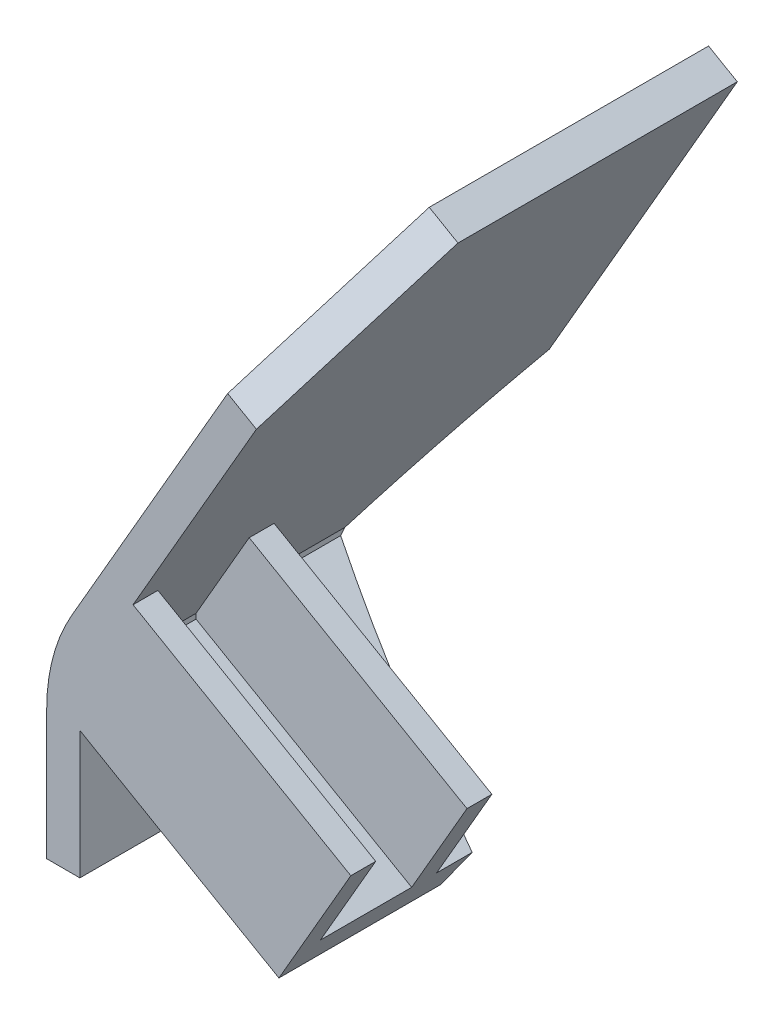
ISO-10303-21;
HEADER;
FILE_DESCRIPTION(('STEP AP214'),'2;1');
FILE_NAME('part.step','',(''),(''),'','','');
FILE_SCHEMA(('AUTOMOTIVE_DESIGN { 1 0 10303 214 1 1 1 1 }'));
ENDSEC;
DATA;
#1=APPLICATION_CONTEXT('core data for automotive mechanical design processes');
#2=APPLICATION_PROTOCOL_DEFINITION('international standard','automotive_design',2000,#1);
#3=PRODUCT_CONTEXT('',#1,'mechanical');
#4=PRODUCT('Part','Part','',(#3));
#5=PRODUCT_RELATED_PRODUCT_CATEGORY('part','',(#4));
#6=PRODUCT_DEFINITION_FORMATION('','',#4);
#7=PRODUCT_DEFINITION_CONTEXT('part definition',#1,'design');
#8=PRODUCT_DEFINITION('design','',#6,#7);
#9=PRODUCT_DEFINITION_SHAPE('','',#8);
#10=(LENGTH_UNIT() NAMED_UNIT(*) SI_UNIT(.MILLI.,.METRE.));
#11=(NAMED_UNIT(*) PLANE_ANGLE_UNIT() SI_UNIT($,.RADIAN.));
#12=(NAMED_UNIT(*) SI_UNIT($,.STERADIAN.) SOLID_ANGLE_UNIT());
#13=UNCERTAINTY_MEASURE_WITH_UNIT(LENGTH_MEASURE(1.E-05),#10,'distance_accuracy_value','');
#14=(GEOMETRIC_REPRESENTATION_CONTEXT(3) GLOBAL_UNCERTAINTY_ASSIGNED_CONTEXT((#13)) GLOBAL_UNIT_ASSIGNED_CONTEXT((#10,
#11,#12)) REPRESENTATION_CONTEXT('',''));
#15=CARTESIAN_POINT('',(0.,0.,0.));
#16=DIRECTION('',(0.,0.,1.));
#17=DIRECTION('',(1.,0.,0.));
#18=AXIS2_PLACEMENT_3D('',#15,#16,#17);
#19=CARTESIAN_POINT('',(-23.0092104418444,-16.2678308865809,18.));
#20=DIRECTION('',(1.,0.,0.));
#21=DIRECTION('',(0.,0.,-1.));
#22=AXIS2_PLACEMENT_3D('',#19,#20,#21);
#23=PLANE('',#22);
#24=CARTESIAN_POINT('',(-23.0092104418444,-44.4746281955842,-57.4228165048761));
#25=DIRECTION('',(-1.,0.,0.));
#26=DIRECTION('',(0.,0.,1.));
#27=AXIS2_PLACEMENT_3D('',#24,#25,#26);
#28=CIRCLE('',#27,67.4999999999585);
#29=CARTESIAN_POINT('',(-23.0092104418444,-16.2678308865809,3.90113139122078));
#30=VERTEX_POINT('',#29);
#31=CARTESIAN_POINT('',(-23.0092104418444,-4.55513627132909,-2.99227209731268));
#32=VERTEX_POINT('',#31);
#33=EDGE_CURVE('E183',#30,#32,#28,.T.);
#34=ORIENTED_EDGE('',*,*,#33,.F.);
#35=DIRECTION('',(0.,0.,-1.));
#36=VECTOR('',#35,1.);
#37=CARTESIAN_POINT('',(-23.0092104418444,-16.2678308865809,18.));
#38=LINE('',#37,#36);
#39=CARTESIAN_POINT('',(-23.0092104418444,-16.2678308865809,18.));
#40=VERTEX_POINT('',#39);
#41=EDGE_CURVE('E199',#40,#30,#38,.T.);
#42=ORIENTED_EDGE('',*,*,#41,.F.);
#43=DIRECTION('',(0.,-1.,0.));
#44=VECTOR('',#43,1.);
#45=CARTESIAN_POINT('',(-23.0092104418444,-16.2678308865809,18.));
#46=LINE('',#45,#44);
#47=CARTESIAN_POINT('',(-23.0092104418444,-4.55513627132909,18.));
#48=VERTEX_POINT('',#47);
#49=EDGE_CURVE('E307',#48,#40,#46,.T.);
#50=ORIENTED_EDGE('',*,*,#49,.F.);
#51=DIRECTION('',(0.,0.,-1.));
#52=VECTOR('',#51,1.);
#53=CARTESIAN_POINT('',(-23.0092104418444,-4.55513627132909,18.));
#54=LINE('',#53,#52);
#55=EDGE_CURVE('E201',#48,#32,#54,.T.);
#56=ORIENTED_EDGE('',*,*,#55,.T.);
#57=EDGE_LOOP('',(#34,#42,#50,#56));
#58=FACE_BOUND('',#57,.T.);
#59=ADVANCED_FACE('F46',(#58),#23,.F.);
#60=CARTESIAN_POINT('',(-20.0092104418444,-0.803847577293367,18.));
#61=DIRECTION('',(-0.866025403784439,0.5,0.));
#62=DIRECTION('',(-0.5,-0.866025403784439,0.));
#63=AXIS2_PLACEMENT_3D('',#60,#61,#62);
#64=PLANE('',#63);
#65=DIRECTION('',(0.,0.,-1.));
#66=VECTOR('',#65,1.);
#67=CARTESIAN_POINT('',(-20.0092104418444,-0.803847577293367,18.));
#68=LINE('',#67,#66);
#69=CARTESIAN_POINT('',(-20.0092104418444,-0.803847577293367,5.25));
#70=VERTEX_POINT('',#69);
#71=CARTESIAN_POINT('',(-20.0092104418444,-0.803847577293369,-5.95328260195916));
#72=VERTEX_POINT('',#71);
#73=EDGE_CURVE('E320',#70,#72,#68,.T.);
#74=ORIENTED_EDGE('',*,*,#73,.T.);
#75=CARTESIAN_POINT('',(-45.2225473875357,-44.4746281955842,-57.4228165048761));
#76=DIRECTION('',(-0.866025403784439,0.5,0.));
#77=DIRECTION('',(-0.5,-0.866025403784439,0.));
#78=AXIS2_PLACEMENT_3D('',#75,#76,#77);
#79=ELLIPSE('',#78,77.9422863405516,67.4999999999585);
#80=CARTESIAN_POINT('',(-13.5887493290389,10.316717278106,-18.));
#81=VERTEX_POINT('',#80);
#82=EDGE_CURVE('E194',#72,#81,#79,.T.);
#83=ORIENTED_EDGE('',*,*,#82,.T.);
#84=DIRECTION('',(0.5,0.866025403784439,0.));
#85=VECTOR('',#84,1.);
#86=CARTESIAN_POINT('',(-20.0092104418444,-0.803847577293367,-18.));
#87=LINE('',#86,#85);
#88=CARTESIAN_POINT('',(3.4161113789648,39.77,-18.));
#89=VERTEX_POINT('',#88);
#90=EDGE_CURVE('E231',#81,#89,#87,.T.);
#91=ORIENTED_EDGE('',*,*,#90,.T.);
#92=DIRECTION('',(0.,0.,-1.));
#93=VECTOR('',#92,1.);
#94=CARTESIAN_POINT('',(3.4161113789648,39.77,18.));
#95=LINE('',#94,#93);
#96=CARTESIAN_POINT('',(3.4161113789648,39.77,7.2485351115768));
#97=VERTEX_POINT('',#96);
#98=EDGE_CURVE('E221',#97,#89,#95,.T.);
#99=ORIENTED_EDGE('',*,*,#98,.F.);
#100=DIRECTION('',(0.405819313764916,0.70289967013357,-0.58415985680419));
#101=VECTOR('',#100,1.);
#102=CARTESIAN_POINT('',(-14.5642677858138,8.62706974725056,33.1305357012939));
#103=LINE('',#102,#101);
#104=CARTESIAN_POINT('',(-4.05299498321717,26.8331282935649,18.));
#105=VERTEX_POINT('',#104);
#106=EDGE_CURVE('E69',#105,#97,#103,.T.);
#107=ORIENTED_EDGE('',*,*,#106,.F.);
#108=DIRECTION('',(0.5,0.866025403784439,0.));
#109=VECTOR('',#108,1.);
#110=CARTESIAN_POINT('',(-20.0092104418444,-0.803847577293367,18.));
#111=LINE('',#110,#109);
#112=CARTESIAN_POINT('',(-15.2053116366151,7.51674922778309,18.));
#113=VERTEX_POINT('',#112);
#114=EDGE_CURVE('E314',#113,#105,#111,.T.);
#115=ORIENTED_EDGE('',*,*,#114,.F.);
#116=DIRECTION('',(0.,0.,-1.));
#117=VECTOR('',#116,1.);
#118=CARTESIAN_POINT('',(-15.2053116366151,7.51674922778309,18.));
#119=LINE('',#118,#117);
#120=CARTESIAN_POINT('',(-15.2053116366151,7.51674922778309,15.75));
#121=VERTEX_POINT('',#120);
#122=EDGE_CURVE('E289',#113,#121,#119,.T.);
#123=ORIENTED_EDGE('',*,*,#122,.T.);
#124=DIRECTION('',(-0.5,-0.866025403784439,0.));
#125=VECTOR('',#124,1.);
#126=CARTESIAN_POINT('',(-15.2053116366151,7.51674922778308,15.75));
#127=LINE('',#126,#125);
#128=CARTESIAN_POINT('',(-20.0092104418444,-0.803847577293367,15.75));
#129=VERTEX_POINT('',#128);
#130=EDGE_CURVE('E287',#121,#129,#127,.T.);
#131=ORIENTED_EDGE('',*,*,#130,.T.);
#132=CARTESIAN_POINT('',(-20.0092104418444,-0.803847577293367,7.5));
#133=VERTEX_POINT('',#132);
#134=EDGE_CURVE('E212',#129,#133,#68,.T.);
#135=ORIENTED_EDGE('',*,*,#134,.T.);
#136=DIRECTION('',(0.5,0.866025403784439,0.));
#137=VECTOR('',#136,1.);
#138=CARTESIAN_POINT('',(-20.2053116366151,-1.1435048100613,7.5));
#139=LINE('',#138,#137);
#140=CARTESIAN_POINT('',(-15.2053116366151,7.51674922778309,7.5));
#141=VERTEX_POINT('',#140);
#142=EDGE_CURVE('E298',#133,#141,#139,.T.);
#143=ORIENTED_EDGE('',*,*,#142,.T.);
#144=DIRECTION('',(0.,0.,-1.));
#145=VECTOR('',#144,1.);
#146=CARTESIAN_POINT('',(-15.2053116366151,7.51674922778309,7.5));
#147=LINE('',#146,#145);
#148=CARTESIAN_POINT('',(-15.2053116366151,7.51674922778309,5.25));
#149=VERTEX_POINT('',#148);
#150=EDGE_CURVE('E296',#141,#149,#147,.T.);
#151=ORIENTED_EDGE('',*,*,#150,.T.);
#152=DIRECTION('',(-0.5,-0.866025403784439,0.));
#153=VECTOR('',#152,1.);
#154=CARTESIAN_POINT('',(-15.2053116366151,7.51674922778308,5.25));
#155=LINE('',#154,#153);
#156=EDGE_CURVE('E305',#149,#70,#155,.T.);
#157=ORIENTED_EDGE('',*,*,#156,.T.);
#158=EDGE_LOOP('',(#74,#83,#91,#99,#107,#115,#123,#131,#135,#143,#151,#157));
#159=FACE_BOUND('',#158,.T.);
#160=ADVANCED_FACE('F230',(#159),#64,.F.);
#161=CARTESIAN_POINT('',(-23.0092104418444,0.,18.));
#162=DIRECTION('',(0.866025403784439,-0.5,0.));
#163=DIRECTION('',(0.5,0.866025403784439,0.));
#164=AXIS2_PLACEMENT_3D('',#161,#162,#163);
#165=PLANE('',#164);
#166=DIRECTION('',(-0.5,-0.866025403784439,0.));
#167=VECTOR('',#166,1.);
#168=CARTESIAN_POINT('',(-23.0092104418444,0.,-18.));
#169=LINE('',#168,#167);
#170=CARTESIAN_POINT('',(0.81803516761145,41.27,-18.));
#171=VERTEX_POINT('',#170);
#172=CARTESIAN_POINT('',(-17.0528509441766,10.316717278106,-18.));
#173=VERTEX_POINT('',#172);
#174=EDGE_CURVE('E284',#171,#173,#169,.T.);
#175=ORIENTED_EDGE('',*,*,#174,.T.);
#176=CARTESIAN_POINT('',(-48.6866490026734,-44.4746281955842,-57.4228165048761));
#177=DIRECTION('',(0.866025403784439,-0.5,0.));
#178=DIRECTION('',(-0.5,-0.866025403784439,0.));
#179=AXIS2_PLACEMENT_3D('',#176,#177,#178);
#180=ELLIPSE('',#179,77.9422863405516,67.4999999999585);
#181=CARTESIAN_POINT('',(-20.7316423061798,3.94486372867091,-10.3930089165881));
#182=VERTEX_POINT('',#181);
#183=EDGE_CURVE('E363',#173,#182,#180,.T.);
#184=ORIENTED_EDGE('',*,*,#183,.T.);
#185=DIRECTION('',(0.,0.,-1.));
#186=VECTOR('',#185,1.);
#187=CARTESIAN_POINT('',(-20.7316423061798,3.94486372867091,18.));
#188=LINE('',#187,#186);
#189=CARTESIAN_POINT('',(-20.7316423061798,3.94486372867091,18.));
#190=VERTEX_POINT('',#189);
#191=EDGE_CURVE('E209',#182,#190,#188,.F.);
#192=ORIENTED_EDGE('',*,*,#191,.T.);
#193=DIRECTION('',(-0.5,-0.866025403784439,0.));
#194=VECTOR('',#193,1.);
#195=CARTESIAN_POINT('',(-23.0092104418444,0.,18.));
#196=LINE('',#195,#194);
#197=CARTESIAN_POINT('',(-6.65107119457049,28.3331282935649,18.));
#198=VERTEX_POINT('',#197);
#199=EDGE_CURVE('E306',#198,#190,#196,.T.);
#200=ORIENTED_EDGE('',*,*,#199,.F.);
#201=DIRECTION('',(-0.405819313764916,-0.70289967013357,0.58415985680419));
#202=VECTOR('',#201,1.);
#203=CARTESIAN_POINT('',(-17.4271142115875,9.66847428354355,33.5116613039837));
#204=LINE('',#203,#202);
#205=CARTESIAN_POINT('',(0.818035167611447,41.27,7.2485351115768));
#206=VERTEX_POINT('',#205);
#207=EDGE_CURVE('E371',#206,#198,#204,.T.);
#208=ORIENTED_EDGE('',*,*,#207,.F.);
#209=DIRECTION('',(0.,0.,1.));
#210=VECTOR('',#209,1.);
#211=CARTESIAN_POINT('',(0.818035167611496,41.27,18.));
#212=LINE('',#211,#210);
#213=EDGE_CURVE('E222',#171,#206,#212,.T.);
#214=ORIENTED_EDGE('',*,*,#213,.F.);
#215=EDGE_LOOP('',(#175,#184,#192,#200,#208,#214));
#216=FACE_BOUND('',#215,.T.);
#217=ADVANCED_FACE('F413',(#216),#165,.F.);
#218=CARTESIAN_POINT('',(0.,0.,18.));
#219=DIRECTION('',(0.,0.,1.));
#220=DIRECTION('',(1.,0.,0.));
#221=AXIS2_PLACEMENT_3D('',#218,#219,#220);
#222=PLANE('',#221);
#223=ORIENTED_EDGE('',*,*,#114,.T.);
#224=DIRECTION('',(-0.866025403784438,0.500000000000001,0.));
#225=VECTOR('',#224,1.);
#226=CARTESIAN_POINT('',(10.6058366368128,18.3698479117351,18.));
#227=LINE('',#226,#225);
#228=EDGE_CURVE('E238',#105,#198,#227,.T.);
#229=ORIENTED_EDGE('',*,*,#228,.T.);
#230=ORIENTED_EDGE('',*,*,#199,.T.);
#231=CARTESIAN_POINT('',(-6.00921044184436,-4.55513627132909,18.));
#232=DIRECTION('',(0.,0.,1.));
#233=DIRECTION('',(1.,0.,0.));
#234=AXIS2_PLACEMENT_3D('',#231,#232,#233);
#235=CIRCLE('',#234,17.);
#236=EDGE_CURVE('E217',#190,#48,#235,.T.);
#237=ORIENTED_EDGE('',*,*,#236,.T.);
#238=ORIENTED_EDGE('',*,*,#49,.T.);
#239=DIRECTION('',(1.,0.,0.));
#240=VECTOR('',#239,1.);
#241=CARTESIAN_POINT('',(-20.0092104418444,-16.2678308865809,18.));
#242=LINE('',#241,#240);
#243=CARTESIAN_POINT('',(-20.0092104418444,-16.2678308865809,18.));
#244=VERTEX_POINT('',#243);
#245=EDGE_CURVE('E207',#40,#244,#242,.T.);
#246=ORIENTED_EDGE('',*,*,#245,.T.);
#247=DIRECTION('',(0.,1.,0.));
#248=VECTOR('',#247,1.);
#249=CARTESIAN_POINT('',(-20.0092104418444,-16.2678308865809,18.));
#250=LINE('',#249,#248);
#251=CARTESIAN_POINT('',(-20.0092104418444,-4.72082550278836,18.));
#252=VERTEX_POINT('',#251);
#253=EDGE_CURVE('E315',#244,#252,#250,.T.);
#254=ORIENTED_EDGE('',*,*,#253,.T.);
#255=DIRECTION('',(0.86602540378444,-0.499999999999998,0.));
#256=VECTOR('',#255,1.);
#257=CARTESIAN_POINT('',(-24.305119898776,-2.24058102141463,18.));
#258=LINE('',#257,#256);
#259=CARTESIAN_POINT('',(-2.01882938507779,-15.1075768487364,18.));
#260=VERTEX_POINT('',#259);
#261=EDGE_CURVE('E269',#252,#260,#258,.T.);
#262=ORIENTED_EDGE('',*,*,#261,.T.);
#263=DIRECTION('',(-0.499999999999998,-0.86602540378444,0.));
#264=VECTOR('',#263,1.);
#265=CARTESIAN_POINT('',(-2.01882938507779,-15.1075768487364,18.));
#266=LINE('',#265,#264);
#267=CARTESIAN_POINT('',(4.48117061492218,-3.84924659953871,18.));
#268=VERTEX_POINT('',#267);
#269=EDGE_CURVE('E257',#268,#260,#266,.T.);
#270=ORIENTED_EDGE('',*,*,#269,.F.);
#271=DIRECTION('',(0.86602540378444,-0.499999999999998,0.));
#272=VECTOR('',#271,1.);
#273=CARTESIAN_POINT('',(-17.805119898776,9.01774922778309,18.));
#274=LINE('',#273,#272);
#275=EDGE_CURVE('E270',#113,#268,#274,.T.);
#276=ORIENTED_EDGE('',*,*,#275,.F.);
#277=EDGE_LOOP('',(#223,#229,#230,#237,#238,#246,#254,#262,#270,#276));
#278=FACE_BOUND('',#277,.T.);
#279=ADVANCED_FACE('F384',(#278),#222,.T.);
#280=CARTESIAN_POINT('',(18.0749429989948,31.3067196181703,0.));
#281=DIRECTION('',(0.5,0.866025403784439,0.));
#282=DIRECTION('',(-0.866025403784439,0.5,0.));
#283=AXIS2_PLACEMENT_3D('',#280,#281,#282);
#284=PLANE('',#283);
#285=ORIENTED_EDGE('',*,*,#213,.T.);
#286=DIRECTION('',(0.866025403784439,-0.5,0.));
#287=VECTOR('',#286,1.);
#288=CARTESIAN_POINT('',(18.0749429989948,31.3067196181703,7.24853511157679));
#289=LINE('',#288,#287);
#290=EDGE_CURVE('E54',#206,#97,#289,.T.);
#291=ORIENTED_EDGE('',*,*,#290,.T.);
#292=ORIENTED_EDGE('',*,*,#98,.T.);
#293=DIRECTION('',(-0.866025403784439,0.5,0.));
#294=VECTOR('',#293,1.);
#295=CARTESIAN_POINT('',(18.0749429989948,31.3067196181703,-18.));
#296=LINE('',#295,#294);
#297=EDGE_CURVE('E234',#89,#171,#296,.T.);
#298=ORIENTED_EDGE('',*,*,#297,.T.);
#299=EDGE_LOOP('',(#285,#291,#292,#298));
#300=FACE_BOUND('',#299,.T.);
#301=ADVANCED_FACE('F224',(#300),#284,.T.);
#302=CARTESIAN_POINT('',(0.,0.,-18.));
#303=DIRECTION('',(0.,0.,1.));
#304=DIRECTION('',(1.,0.,0.));
#305=AXIS2_PLACEMENT_3D('',#302,#303,#304);
#306=PLANE('',#305);
#307=ORIENTED_EDGE('',*,*,#90,.F.);
#308=DIRECTION('',(-1.,0.,0.));
#309=VECTOR('',#308,1.);
#310=CARTESIAN_POINT('',(4.48117061492218,10.316717278106,-18.));
#311=LINE('',#310,#309);
#312=EDGE_CURVE('E195',#81,#173,#311,.T.);
#313=ORIENTED_EDGE('',*,*,#312,.T.);
#314=ORIENTED_EDGE('',*,*,#174,.F.);
#315=ORIENTED_EDGE('',*,*,#297,.F.);
#316=EDGE_LOOP('',(#307,#313,#314,#315));
#317=FACE_BOUND('',#316,.T.);
#318=ADVANCED_FACE('F385',(#317),#306,.F.);
#319=CARTESIAN_POINT('',(-20.0092104418444,-16.2678308865809,18.));
#320=DIRECTION('',(-1.,0.,0.));
#321=DIRECTION('',(0.,0.,1.));
#322=AXIS2_PLACEMENT_3D('',#319,#320,#321);
#323=PLANE('',#322);
#324=DIRECTION('',(0.,0.,-1.));
#325=VECTOR('',#324,1.);
#326=CARTESIAN_POINT('',(-20.0092104418444,-16.2678308865809,18.));
#327=LINE('',#326,#325);
#328=CARTESIAN_POINT('',(-20.0092104418444,-16.2678308865809,3.90113139122078));
#329=VERTEX_POINT('',#328);
#330=EDGE_CURVE('E210',#244,#329,#327,.T.);
#331=ORIENTED_EDGE('',*,*,#330,.T.);
#332=CARTESIAN_POINT('',(-20.0092104418444,-44.4746281955842,-57.4228165048761));
#333=DIRECTION('',(-1.,0.,0.));
#334=DIRECTION('',(0.,0.,1.));
#335=AXIS2_PLACEMENT_3D('',#332,#333,#334);
#336=CIRCLE('',#335,67.4999999999585);
#337=CARTESIAN_POINT('',(-20.0092104418444,-4.72082550278836,-2.87114218174777));
#338=VERTEX_POINT('',#337);
#339=EDGE_CURVE('E190',#329,#338,#336,.T.);
#340=ORIENTED_EDGE('',*,*,#339,.T.);
#341=DIRECTION('',(0.,0.,1.));
#342=VECTOR('',#341,1.);
#343=CARTESIAN_POINT('',(-20.0092104418444,-4.72082550278836,-18.));
#344=LINE('',#343,#342);
#345=EDGE_CURVE('E268',#338,#252,#344,.T.);
#346=ORIENTED_EDGE('',*,*,#345,.T.);
#347=ORIENTED_EDGE('',*,*,#253,.F.);
#348=EDGE_LOOP('',(#331,#340,#346,#347));
#349=FACE_BOUND('',#348,.T.);
#350=ADVANCED_FACE('F416',(#349),#323,.F.);
#351=ORIENTED_EDGE('',*,*,#134,.F.);
#352=DIRECTION('',(0.,-1.,0.));
#353=VECTOR('',#352,1.);
#354=CARTESIAN_POINT('',(-20.0092104418444,9.01774922778309,15.75));
#355=LINE('',#354,#353);
#356=CARTESIAN_POINT('',(-20.0092104418444,-1.25672388765061,15.75));
#357=VERTEX_POINT('',#356);
#358=EDGE_CURVE('E290',#129,#357,#355,.T.);
#359=ORIENTED_EDGE('',*,*,#358,.T.);
#360=DIRECTION('',(0.,0.,-1.));
#361=VECTOR('',#360,1.);
#362=CARTESIAN_POINT('',(-20.0092104418444,-1.25672388765061,15.75));
#363=LINE('',#362,#361);
#364=CARTESIAN_POINT('',(-20.0092104418444,-1.25672388765061,7.5));
#365=VERTEX_POINT('',#364);
#366=EDGE_CURVE('E292',#357,#365,#363,.T.);
#367=ORIENTED_EDGE('',*,*,#366,.T.);
#368=DIRECTION('',(0.,1.,0.));
#369=VECTOR('',#368,1.);
#370=CARTESIAN_POINT('',(-20.0092104418444,0.357495189938692,7.5));
#371=LINE('',#370,#369);
#372=EDGE_CURVE('E295',#365,#133,#371,.T.);
#373=ORIENTED_EDGE('',*,*,#372,.T.);
#374=EDGE_LOOP('',(#351,#359,#367,#373));
#375=FACE_BOUND('',#374,.T.);
#376=ADVANCED_FACE('F421',(#375),#323,.F.);
#377=CARTESIAN_POINT('',(-20.0092104418444,-16.2678308865809,18.));
#378=DIRECTION('',(0.,1.,0.));
#379=DIRECTION('',(0.,0.,1.));
#380=AXIS2_PLACEMENT_3D('',#377,#378,#379);
#381=PLANE('',#380);
#382=ORIENTED_EDGE('',*,*,#41,.T.);
#383=DIRECTION('',(-1.,0.,0.));
#384=VECTOR('',#383,1.);
#385=CARTESIAN_POINT('',(4.48117061492218,-16.2678308865809,3.90113139122078));
#386=LINE('',#385,#384);
#387=EDGE_CURVE('E181',#30,#329,#386,.F.);
#388=ORIENTED_EDGE('',*,*,#387,.T.);
#389=ORIENTED_EDGE('',*,*,#330,.F.);
#390=ORIENTED_EDGE('',*,*,#245,.F.);
#391=EDGE_LOOP('',(#382,#388,#389,#390));
#392=FACE_BOUND('',#391,.T.);
#393=ADVANCED_FACE('F202',(#392),#381,.F.);
#394=DIRECTION('',(0.,0.,-1.));
#395=VECTOR('',#394,1.);
#396=CARTESIAN_POINT('',(-20.0092104418444,-1.25672388765061,5.25));
#397=LINE('',#396,#395);
#398=CARTESIAN_POINT('',(-20.0092104418444,-1.25672388765061,5.25));
#399=VERTEX_POINT('',#398);
#400=CARTESIAN_POINT('',(-20.0092104418444,-1.25672388765061,-5.57242839422935));
#401=VERTEX_POINT('',#400);
#402=EDGE_CURVE('E261',#399,#401,#397,.T.);
#403=ORIENTED_EDGE('',*,*,#402,.T.);
#404=CARTESIAN_POINT('',(-20.0092104418444,-44.4746281955842,-57.4228165048761));
#405=DIRECTION('',(-1.,0.,0.));
#406=DIRECTION('',(0.,0.,1.));
#407=AXIS2_PLACEMENT_3D('',#404,#405,#406);
#408=CIRCLE('',#407,67.4999999999585);
#409=EDGE_CURVE('E354',#401,#72,#408,.T.);
#410=ORIENTED_EDGE('',*,*,#409,.T.);
#411=ORIENTED_EDGE('',*,*,#73,.F.);
#412=DIRECTION('',(0.,-1.,0.));
#413=VECTOR('',#412,1.);
#414=CARTESIAN_POINT('',(-20.0092104418444,9.01774922778309,5.25));
#415=LINE('',#414,#413);
#416=EDGE_CURVE('E297',#70,#399,#415,.T.);
#417=ORIENTED_EDGE('',*,*,#416,.T.);
#418=EDGE_LOOP('',(#403,#410,#411,#417));
#419=FACE_BOUND('',#418,.T.);
#420=ADVANCED_FACE('F347',(#419),#323,.F.);
#421=CARTESIAN_POINT('',(-6.00921044184436,-4.55513627132909,18.));
#422=DIRECTION('',(0.,0.,-1.));
#423=DIRECTION('',(-1.,0.,0.));
#424=AXIS2_PLACEMENT_3D('',#421,#422,#423);
#425=CYLINDRICAL_SURFACE('',#424,17.);
#426=CARTESIAN_POINT('',(-23.0092104418444,-4.55513627132909,-2.99227209731268));
#427=CARTESIAN_POINT('',(-23.0092052992116,-4.26203123401128,-3.20723136661041));
#428=CARTESIAN_POINT('',(-23.0016302265625,-3.97071787281063,-3.42452783636832));
#429=CARTESIAN_POINT('',(-22.9718574182399,-3.39214480364554,-3.86339805470355));
#430=CARTESIAN_POINT('',(-22.9496616350024,-3.10488455966255,-4.08497122833942));
#431=CARTESIAN_POINT('',(-22.8619505507816,-2.25011192761611,-4.7553307993193));
#432=CARTESIAN_POINT('',(-22.775310268414,-1.68925712668632,-5.21001443649554));
#433=CARTESIAN_POINT('',(-22.551259014474,-0.596990472860894,-6.12463842814552));
#434=CARTESIAN_POINT('',(-22.4146275747357,-0.0652635285019314,-6.58439816680741));
#435=CARTESIAN_POINT('',(-22.0936356206156,0.975477336409555,-7.51265859686822));
#436=CARTESIAN_POINT('',(-21.9092856265406,1.48449623434653,-7.98115734051666));
#437=CARTESIAN_POINT('',(-21.56158355932,2.31929488614157,-8.7730897222086));
#438=CARTESIAN_POINT('',(-21.4103591050796,2.65163241001722,-9.09501855584457));
#439=CARTESIAN_POINT('',(-21.0867118259559,3.30633623156159,-9.74218438073065));
#440=CARTESIAN_POINT('',(-20.914182814312,3.62864166210686,-10.0674298693529));
#441=CARTESIAN_POINT('',(-20.7316423061798,3.94486372867091,-10.3930089165881));
#442=B_SPLINE_CURVE_WITH_KNOTS('',3,(#426,#427,#428,#429,#430,#431,#432,#433,#434,#435,#436,
#437,#438,#439,#440,#441),.UNSPECIFIED.,.F.,.F.,(4,2,2,2,2,2,2,4),(0.,1.09023800501288,
2.18033045017199,4.35921538197227,6.50547920317367,8.65127024913239,10.1110830538454,
11.5784901835156),.UNSPECIFIED.);
#443=EDGE_CURVE('E364',#32,#182,#442,.T.);
#444=ORIENTED_EDGE('',*,*,#443,.F.);
#445=ORIENTED_EDGE('',*,*,#55,.F.);
#446=ORIENTED_EDGE('',*,*,#236,.F.);
#447=ORIENTED_EDGE('',*,*,#191,.F.);
#448=EDGE_LOOP('',(#444,#445,#446,#447));
#449=FACE_BOUND('',#448,.T.);
#450=ADVANCED_FACE('F48',(#449),#425,.T.);
#451=CARTESIAN_POINT('',(-17.805119898776,9.01774922778309,18.));
#452=DIRECTION('',(-0.499999999999998,-0.86602540378444,0.));
#453=DIRECTION('',(0.86602540378444,-0.499999999999998,0.));
#454=AXIS2_PLACEMENT_3D('',#451,#452,#453);
#455=PLANE('',#454);
#456=ORIENTED_EDGE('',*,*,#122,.F.);
#457=ORIENTED_EDGE('',*,*,#275,.T.);
#458=DIRECTION('',(0.,0.,-1.));
#459=VECTOR('',#458,1.);
#460=CARTESIAN_POINT('',(4.48117061492218,-3.84924659953871,18.));
#461=LINE('',#460,#459);
#462=CARTESIAN_POINT('',(4.48117061492218,-3.84924659953871,15.75));
#463=VERTEX_POINT('',#462);
#464=EDGE_CURVE('E249',#268,#463,#461,.T.);
#465=ORIENTED_EDGE('',*,*,#464,.T.);
#466=DIRECTION('',(0.86602540378444,-0.499999999999998,0.));
#467=VECTOR('',#466,1.);
#468=CARTESIAN_POINT('',(-17.805119898776,9.01774922778309,15.75));
#469=LINE('',#468,#467);
#470=EDGE_CURVE('E272',#121,#463,#469,.T.);
#471=ORIENTED_EDGE('',*,*,#470,.F.);
#472=EDGE_LOOP('',(#456,#457,#465,#471));
#473=FACE_BOUND('',#472,.T.);
#474=ADVANCED_FACE('F389',(#473),#455,.F.);
#475=CARTESIAN_POINT('',(-17.805119898776,9.01774922778309,15.75));
#476=DIRECTION('',(0.,0.,1.));
#477=DIRECTION('',(1.,0.,0.));
#478=AXIS2_PLACEMENT_3D('',#475,#476,#477);
#479=PLANE('',#478);
#480=ORIENTED_EDGE('',*,*,#358,.F.);
#481=ORIENTED_EDGE('',*,*,#130,.F.);
#482=ORIENTED_EDGE('',*,*,#470,.T.);
#483=DIRECTION('',(-0.499999999999998,-0.86602540378444,0.));
#484=VECTOR('',#483,1.);
#485=CARTESIAN_POINT('',(4.48117061492218,-3.84924659953871,15.75));
#486=LINE('',#485,#484);
#487=CARTESIAN_POINT('',(-0.518829385077794,-12.5095006373831,15.75));
#488=VERTEX_POINT('',#487);
#489=EDGE_CURVE('E254',#463,#488,#486,.T.);
#490=ORIENTED_EDGE('',*,*,#489,.T.);
#491=DIRECTION('',(0.86602540378444,-0.499999999999998,0.));
#492=VECTOR('',#491,1.);
#493=CARTESIAN_POINT('',(-22.805119898776,0.357495189938688,15.75));
#494=LINE('',#493,#492);
#495=EDGE_CURVE('E271',#357,#488,#494,.T.);
#496=ORIENTED_EDGE('',*,*,#495,.F.);
#497=EDGE_LOOP('',(#480,#481,#482,#490,#496));
#498=FACE_BOUND('',#497,.T.);
#499=ADVANCED_FACE('F386',(#498),#479,.F.);
#500=CARTESIAN_POINT('',(-22.805119898776,0.357495189938688,15.75));
#501=DIRECTION('',(-0.499999999999998,-0.86602540378444,0.));
#502=DIRECTION('',(0.86602540378444,-0.499999999999998,0.));
#503=AXIS2_PLACEMENT_3D('',#500,#501,#502);
#504=PLANE('',#503);
#505=ORIENTED_EDGE('',*,*,#366,.F.);
#506=ORIENTED_EDGE('',*,*,#495,.T.);
#507=DIRECTION('',(0.,0.,1.));
#508=VECTOR('',#507,1.);
#509=CARTESIAN_POINT('',(-0.518829385077795,-12.5095006373831,18.));
#510=LINE('',#509,#508);
#511=CARTESIAN_POINT('',(-0.518829385077796,-12.5095006373831,7.5));
#512=VERTEX_POINT('',#511);
#513=EDGE_CURVE('E265',#512,#488,#510,.T.);
#514=ORIENTED_EDGE('',*,*,#513,.F.);
#515=DIRECTION('',(0.86602540378444,-0.499999999999998,0.));
#516=VECTOR('',#515,1.);
#517=CARTESIAN_POINT('',(-22.805119898776,0.357495189938692,7.5));
#518=LINE('',#517,#516);
#519=EDGE_CURVE('E273',#365,#512,#518,.T.);
#520=ORIENTED_EDGE('',*,*,#519,.F.);
#521=EDGE_LOOP('',(#505,#506,#514,#520));
#522=FACE_BOUND('',#521,.T.);
#523=ADVANCED_FACE('F395',(#522),#504,.F.);
#524=CARTESIAN_POINT('',(-22.805119898776,0.357495189938692,7.5));
#525=DIRECTION('',(0.,0.,-1.));
#526=DIRECTION('',(-1.,0.,0.));
#527=AXIS2_PLACEMENT_3D('',#524,#525,#526);
#528=PLANE('',#527);
#529=ORIENTED_EDGE('',*,*,#372,.F.);
#530=ORIENTED_EDGE('',*,*,#519,.T.);
#531=DIRECTION('',(-0.499999999999998,-0.86602540378444,0.));
#532=VECTOR('',#531,1.);
#533=CARTESIAN_POINT('',(4.48117061492218,-3.84924659953871,7.5));
#534=LINE('',#533,#532);
#535=CARTESIAN_POINT('',(4.48117061492218,-3.84924659953871,7.5));
#536=VERTEX_POINT('',#535);
#537=EDGE_CURVE('E250',#536,#512,#534,.T.);
#538=ORIENTED_EDGE('',*,*,#537,.F.);
#539=DIRECTION('',(0.86602540378444,-0.499999999999998,0.));
#540=VECTOR('',#539,1.);
#541=CARTESIAN_POINT('',(-17.805119898776,9.01774922778309,7.5));
#542=LINE('',#541,#540);
#543=EDGE_CURVE('E280',#141,#536,#542,.T.);
#544=ORIENTED_EDGE('',*,*,#543,.F.);
#545=ORIENTED_EDGE('',*,*,#142,.F.);
#546=EDGE_LOOP('',(#529,#530,#538,#544,#545));
#547=FACE_BOUND('',#546,.T.);
#548=ADVANCED_FACE('F334',(#547),#528,.F.);
#549=CARTESIAN_POINT('',(-17.805119898776,9.01774922778309,7.5));
#550=DIRECTION('',(-0.499999999999998,-0.86602540378444,0.));
#551=DIRECTION('',(0.86602540378444,-0.499999999999998,0.));
#552=AXIS2_PLACEMENT_3D('',#549,#550,#551);
#553=PLANE('',#552);
#554=ORIENTED_EDGE('',*,*,#150,.F.);
#555=ORIENTED_EDGE('',*,*,#543,.T.);
#556=DIRECTION('',(0.,0.,-1.));
#557=VECTOR('',#556,1.);
#558=CARTESIAN_POINT('',(4.48117061492218,-3.84924659953871,5.25));
#559=LINE('',#558,#557);
#560=CARTESIAN_POINT('',(4.48117061492218,-3.84924659953871,5.25));
#561=VERTEX_POINT('',#560);
#562=EDGE_CURVE('E236',#536,#561,#559,.T.);
#563=ORIENTED_EDGE('',*,*,#562,.T.);
#564=DIRECTION('',(0.86602540378444,-0.499999999999998,0.));
#565=VECTOR('',#564,1.);
#566=CARTESIAN_POINT('',(-17.805119898776,9.01774922778309,5.25));
#567=LINE('',#566,#565);
#568=EDGE_CURVE('E276',#149,#561,#567,.T.);
#569=ORIENTED_EDGE('',*,*,#568,.F.);
#570=EDGE_LOOP('',(#554,#555,#563,#569));
#571=FACE_BOUND('',#570,.T.);
#572=ADVANCED_FACE('F337',(#571),#553,.F.);
#573=CARTESIAN_POINT('',(-17.805119898776,9.01774922778309,5.25));
#574=DIRECTION('',(0.,0.,1.));
#575=DIRECTION('',(0.,-1.,0.));
#576=AXIS2_PLACEMENT_3D('',#573,#574,#575);
#577=PLANE('',#576);
#578=ORIENTED_EDGE('',*,*,#416,.F.);
#579=ORIENTED_EDGE('',*,*,#156,.F.);
#580=ORIENTED_EDGE('',*,*,#568,.T.);
#581=DIRECTION('',(-0.499999999999998,-0.86602540378444,0.));
#582=VECTOR('',#581,1.);
#583=CARTESIAN_POINT('',(4.48117061492218,-3.84924659953871,5.25));
#584=LINE('',#583,#582);
#585=CARTESIAN_POINT('',(-0.518829385077794,-12.5095006373831,5.25));
#586=VERTEX_POINT('',#585);
#587=EDGE_CURVE('E242',#561,#586,#584,.T.);
#588=ORIENTED_EDGE('',*,*,#587,.T.);
#589=DIRECTION('',(0.86602540378444,-0.499999999999998,0.));
#590=VECTOR('',#589,1.);
#591=CARTESIAN_POINT('',(-22.805119898776,0.357495189938692,5.25));
#592=LINE('',#591,#590);
#593=EDGE_CURVE('E282',#399,#586,#592,.T.);
#594=ORIENTED_EDGE('',*,*,#593,.F.);
#595=EDGE_LOOP('',(#578,#579,#580,#588,#594));
#596=FACE_BOUND('',#595,.T.);
#597=ADVANCED_FACE('F345',(#596),#577,.F.);
#598=CARTESIAN_POINT('',(-22.805119898776,0.357495189938692,5.25));
#599=DIRECTION('',(-0.499999999999998,-0.86602540378444,0.));
#600=DIRECTION('',(0.86602540378444,-0.499999999999998,0.));
#601=AXIS2_PLACEMENT_3D('',#598,#599,#600);
#602=PLANE('',#601);
#603=CARTESIAN_POINT('',(-0.518829385077794,-12.5095006373831,2.0286815433845));
#604=VERTEX_POINT('',#603);
#605=EDGE_CURVE('E263',#604,#586,#510,.T.);
#606=ORIENTED_EDGE('',*,*,#605,.F.);
#607=CARTESIAN_POINT('',(54.8463956161469,-44.4746281955842,-57.4228165048761));
#608=DIRECTION('',(-0.499999999999998,-0.86602540378444,0.));
#609=DIRECTION('',(-0.86602540378444,0.499999999999998,0.));
#610=AXIS2_PLACEMENT_3D('',#607,#608,#609);
#611=ELLIPSE('',#610,134.999999999918,67.4999999999585);
#612=EDGE_CURVE('E65',#604,#401,#611,.T.);
#613=ORIENTED_EDGE('',*,*,#612,.T.);
#614=ORIENTED_EDGE('',*,*,#402,.F.);
#615=ORIENTED_EDGE('',*,*,#593,.T.);
#616=EDGE_LOOP('',(#606,#613,#614,#615));
#617=FACE_BOUND('',#616,.T.);
#618=ADVANCED_FACE('F346',(#617),#602,.F.);
#619=CARTESIAN_POINT('',(-24.305119898776,-2.24058102141463,-18.));
#620=DIRECTION('',(0.499999999999998,0.86602540378444,0.));
#621=DIRECTION('',(-0.86602540378444,0.499999999999998,0.));
#622=AXIS2_PLACEMENT_3D('',#619,#620,#621);
#623=PLANE('',#622);
#624=ORIENTED_EDGE('',*,*,#345,.F.);
#625=CARTESIAN_POINT('',(48.8463956161469,-44.4746281955842,-57.4228165048761));
#626=DIRECTION('',(0.499999999999998,0.86602540378444,0.));
#627=DIRECTION('',(-0.86602540378444,0.499999999999998,0.));
#628=AXIS2_PLACEMENT_3D('',#625,#626,#627);
#629=ELLIPSE('',#628,134.999999999918,67.4999999999585);
#630=CARTESIAN_POINT('',(-2.01882938507779,-15.1075768487364,3.35404007051785));
#631=VERTEX_POINT('',#630);
#632=EDGE_CURVE('E205',#338,#631,#629,.T.);
#633=ORIENTED_EDGE('',*,*,#632,.T.);
#634=DIRECTION('',(0.,0.,-1.));
#635=VECTOR('',#634,1.);
#636=CARTESIAN_POINT('',(-2.01882938507779,-15.1075768487364,18.));
#637=LINE('',#636,#635);
#638=EDGE_CURVE('E256',#260,#631,#637,.T.);
#639=ORIENTED_EDGE('',*,*,#638,.F.);
#640=ORIENTED_EDGE('',*,*,#261,.F.);
#641=EDGE_LOOP('',(#624,#633,#639,#640));
#642=FACE_BOUND('',#641,.T.);
#643=ADVANCED_FACE('F387',(#642),#623,.F.);
#644=CARTESIAN_POINT('',(5.02765063150734,-2.90271544549214,0.));
#645=DIRECTION('',(-0.86602540378444,0.499999999999998,0.));
#646=DIRECTION('',(-0.499999999999998,-0.86602540378444,0.));
#647=AXIS2_PLACEMENT_3D('',#644,#645,#646);
#648=PLANE('',#647);
#649=ORIENTED_EDGE('',*,*,#638,.T.);
#650=CARTESIAN_POINT('',(-18.9739043854858,-44.4746281955842,-57.4228165048761));
#651=DIRECTION('',(-0.86602540378444,0.499999999999998,0.));
#652=DIRECTION('',(-0.499999999999998,-0.86602540378444,0.));
#653=AXIS2_PLACEMENT_3D('',#650,#651,#652);
#654=ELLIPSE('',#653,77.9422863405514,67.4999999999585);
#655=EDGE_CURVE('E11',#631,#604,#654,.T.);
#656=ORIENTED_EDGE('',*,*,#655,.T.);
#657=ORIENTED_EDGE('',*,*,#605,.T.);
#658=ORIENTED_EDGE('',*,*,#587,.F.);
#659=ORIENTED_EDGE('',*,*,#562,.F.);
#660=ORIENTED_EDGE('',*,*,#537,.T.);
#661=ORIENTED_EDGE('',*,*,#513,.T.);
#662=ORIENTED_EDGE('',*,*,#489,.F.);
#663=ORIENTED_EDGE('',*,*,#464,.F.);
#664=ORIENTED_EDGE('',*,*,#269,.T.);
#665=EDGE_LOOP('',(#649,#656,#657,#658,#659,#660,#661,#662,#663,#664));
#666=FACE_BOUND('',#665,.T.);
#667=ADVANCED_FACE('F378',(#666),#648,.F.);
#668=CARTESIAN_POINT('',(7.88630507583547,13.6594810753353,21.9146514553402));
#669=DIRECTION('',(0.292079928402095,0.505897275863509,0.811638627529831));
#670=DIRECTION('',(0.,-0.848644702897065,0.528963295744376));
#671=AXIS2_PLACEMENT_3D('',#668,#669,#670);
#672=PLANE('',#671);
#673=ORIENTED_EDGE('',*,*,#106,.T.);
#674=ORIENTED_EDGE('',*,*,#290,.F.);
#675=ORIENTED_EDGE('',*,*,#207,.T.);
#676=ORIENTED_EDGE('',*,*,#228,.F.);
#677=EDGE_LOOP('',(#673,#674,#675,#676));
#678=FACE_BOUND('',#677,.T.);
#679=ADVANCED_FACE('F376',(#678),#672,.T.);
#680=CARTESIAN_POINT('',(4.48117061492218,-44.4746281955842,-57.4228165048761));
#681=DIRECTION('',(-1.,0.,0.));
#682=DIRECTION('',(0.,0.,1.));
#683=AXIS2_PLACEMENT_3D('',#680,#681,#682);
#684=CYLINDRICAL_SURFACE('',#683,67.4999999999585);
#685=ORIENTED_EDGE('',*,*,#443,.T.);
#686=ORIENTED_EDGE('',*,*,#183,.F.);
#687=ORIENTED_EDGE('',*,*,#312,.F.);
#688=ORIENTED_EDGE('',*,*,#82,.F.);
#689=ORIENTED_EDGE('',*,*,#409,.F.);
#690=ORIENTED_EDGE('',*,*,#612,.F.);
#691=ORIENTED_EDGE('',*,*,#655,.F.);
#692=ORIENTED_EDGE('',*,*,#632,.F.);
#693=ORIENTED_EDGE('',*,*,#339,.F.);
#694=ORIENTED_EDGE('',*,*,#387,.F.);
#695=ORIENTED_EDGE('',*,*,#33,.T.);
#696=EDGE_LOOP('',(#685,#686,#687,#688,#689,#690,#691,#692,#693,#694,#695));
#697=FACE_BOUND('',#696,.T.);
#698=ADVANCED_FACE('F182',(#697),#684,.F.);
#699=CLOSED_SHELL('',(#59,#160,#217,#279,#301,#318,#350,#376,#393,#420,#450,#474,#499,#523,#548,
#572,#597,#618,#643,#667,#679,#698));
#700=MANIFOLD_SOLID_BREP('B2',#699);
#701=ADVANCED_BREP_SHAPE_REPRESENTATION('',(#18,#700),#14);
#702=SHAPE_DEFINITION_REPRESENTATION(#9,#701);
ENDSEC;
END-ISO-10303-21;
